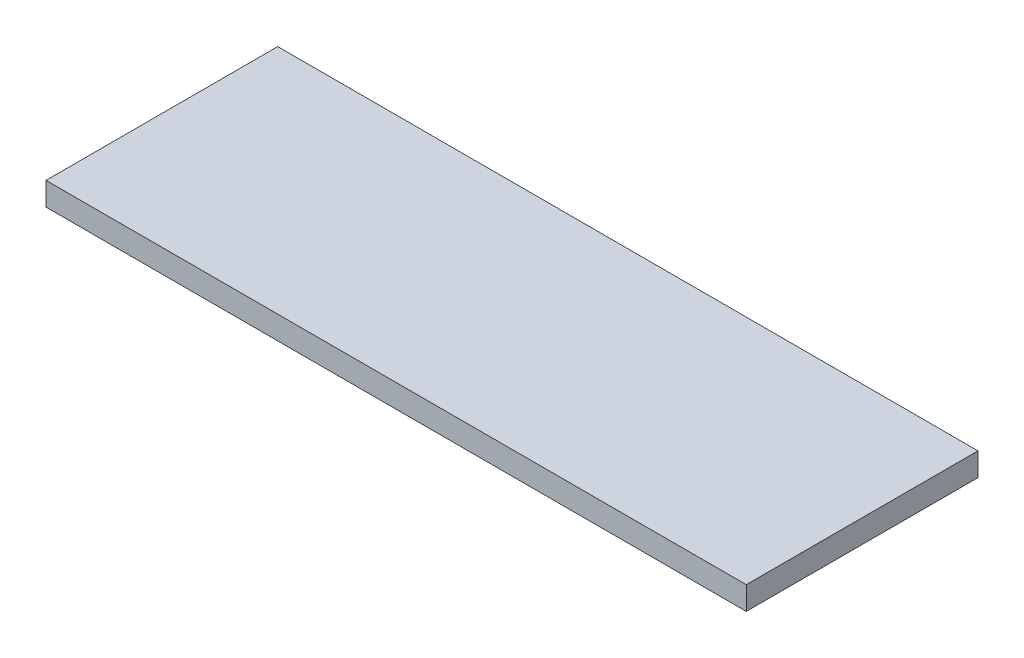
ISO-10303-21;
HEADER;
FILE_DESCRIPTION(('STEP AP214'),'2;1');
FILE_NAME('part.step','',(''),(''),'','','');
FILE_SCHEMA(('AUTOMOTIVE_DESIGN { 1 0 10303 214 1 1 1 1 }'));
ENDSEC;
DATA;
#1=APPLICATION_CONTEXT('core data for automotive mechanical design processes');
#2=APPLICATION_PROTOCOL_DEFINITION('international standard','automotive_design',2000,#1);
#3=PRODUCT_CONTEXT('',#1,'mechanical');
#4=PRODUCT('Part','Part','',(#3));
#5=PRODUCT_RELATED_PRODUCT_CATEGORY('part','',(#4));
#6=PRODUCT_DEFINITION_FORMATION('','',#4);
#7=PRODUCT_DEFINITION_CONTEXT('part definition',#1,'design');
#8=PRODUCT_DEFINITION('design','',#6,#7);
#9=PRODUCT_DEFINITION_SHAPE('','',#8);
#10=(LENGTH_UNIT() NAMED_UNIT(*) SI_UNIT(.MILLI.,.METRE.));
#11=(NAMED_UNIT(*) PLANE_ANGLE_UNIT() SI_UNIT($,.RADIAN.));
#12=(NAMED_UNIT(*) SI_UNIT($,.STERADIAN.) SOLID_ANGLE_UNIT());
#13=UNCERTAINTY_MEASURE_WITH_UNIT(LENGTH_MEASURE(1.E-05),#10,'distance_accuracy_value','');
#14=(GEOMETRIC_REPRESENTATION_CONTEXT(3) GLOBAL_UNCERTAINTY_ASSIGNED_CONTEXT((#13)) GLOBAL_UNIT_ASSIGNED_CONTEXT((#10,
#11,#12)) REPRESENTATION_CONTEXT('',''));
#15=CARTESIAN_POINT('',(0.,0.,0.));
#16=DIRECTION('',(0.,0.,1.));
#17=DIRECTION('',(1.,0.,0.));
#18=AXIS2_PLACEMENT_3D('',#15,#16,#17);
#19=CARTESIAN_POINT('',(-150.628547233686,4.,56.5202333043868));
#20=DIRECTION('',(0.,0.,-1.));
#21=DIRECTION('',(-1.,0.,0.));
#22=AXIS2_PLACEMENT_3D('',#19,#20,#21);
#23=PLANE('',#22);
#24=DIRECTION('',(0.,-1.,0.));
#25=VECTOR('',#24,1.);
#26=CARTESIAN_POINT('',(-29.7472510073546,4.,56.5202333043868));
#27=LINE('',#26,#25);
#28=CARTESIAN_POINT('',(-29.7472510073546,4.,56.5202333043868));
#29=VERTEX_POINT('',#28);
#30=CARTESIAN_POINT('',(-29.7472510073546,0.,56.5202333043868));
#31=VERTEX_POINT('',#30);
#32=EDGE_CURVE('E49',#29,#31,#27,.T.);
#33=ORIENTED_EDGE('',*,*,#32,.F.);
#34=DIRECTION('',(1.,0.,0.));
#35=VECTOR('',#34,1.);
#36=CARTESIAN_POINT('',(-150.628547233686,4.,56.5202333043868));
#37=LINE('',#36,#35);
#38=CARTESIAN_POINT('',(-150.628547233686,4.,56.5202333043868));
#39=VERTEX_POINT('',#38);
#40=EDGE_CURVE('E99',#39,#29,#37,.T.);
#41=ORIENTED_EDGE('',*,*,#40,.F.);
#42=DIRECTION('',(0.,-1.,0.));
#43=VECTOR('',#42,1.);
#44=CARTESIAN_POINT('',(-150.628547233686,4.,56.5202333043868));
#45=LINE('',#44,#43);
#46=CARTESIAN_POINT('',(-150.628547233686,0.,56.5202333043868));
#47=VERTEX_POINT('',#46);
#48=EDGE_CURVE('E43',#39,#47,#45,.T.);
#49=ORIENTED_EDGE('',*,*,#48,.T.);
#50=DIRECTION('',(1.,0.,0.));
#51=VECTOR('',#50,1.);
#52=CARTESIAN_POINT('',(-150.628547233686,0.,56.5202333043868));
#53=LINE('',#52,#51);
#54=EDGE_CURVE('E82',#47,#31,#53,.T.);
#55=ORIENTED_EDGE('',*,*,#54,.T.);
#56=EDGE_LOOP('',(#33,#41,#49,#55));
#57=FACE_BOUND('',#56,.T.);
#58=ADVANCED_FACE('F35',(#57),#23,.F.);
#59=CARTESIAN_POINT('',(-150.628547233686,4.,16.5202333043868));
#60=DIRECTION('',(0.,0.,1.));
#61=DIRECTION('',(1.,0.,0.));
#62=AXIS2_PLACEMENT_3D('',#59,#60,#61);
#63=PLANE('',#62);
#64=DIRECTION('',(0.,1.,0.));
#65=VECTOR('',#64,1.);
#66=CARTESIAN_POINT('',(-29.7472510073546,4.,16.5202333043868));
#67=LINE('',#66,#65);
#68=CARTESIAN_POINT('',(-29.7472510073546,0.,16.5202333043868));
#69=VERTEX_POINT('',#68);
#70=CARTESIAN_POINT('',(-29.7472510073546,4.,16.5202333043868));
#71=VERTEX_POINT('',#70);
#72=EDGE_CURVE('E78',#69,#71,#67,.T.);
#73=ORIENTED_EDGE('',*,*,#72,.F.);
#74=DIRECTION('',(-1.,0.,0.));
#75=VECTOR('',#74,1.);
#76=CARTESIAN_POINT('',(-150.628547233686,0.,16.5202333043868));
#77=LINE('',#76,#75);
#78=CARTESIAN_POINT('',(-150.628547233686,0.,16.5202333043868));
#79=VERTEX_POINT('',#78);
#80=EDGE_CURVE('E72',#69,#79,#77,.T.);
#81=ORIENTED_EDGE('',*,*,#80,.T.);
#82=DIRECTION('',(0.,-1.,0.));
#83=VECTOR('',#82,1.);
#84=CARTESIAN_POINT('',(-150.628547233686,4.,16.5202333043868));
#85=LINE('',#84,#83);
#86=CARTESIAN_POINT('',(-150.628547233686,4.,16.5202333043868));
#87=VERTEX_POINT('',#86);
#88=EDGE_CURVE('E75',#87,#79,#85,.T.);
#89=ORIENTED_EDGE('',*,*,#88,.F.);
#90=DIRECTION('',(-1.,0.,0.));
#91=VECTOR('',#90,1.);
#92=CARTESIAN_POINT('',(-150.628547233686,4.,16.5202333043868));
#93=LINE('',#92,#91);
#94=EDGE_CURVE('E58',#71,#87,#93,.T.);
#95=ORIENTED_EDGE('',*,*,#94,.F.);
#96=EDGE_LOOP('',(#73,#81,#89,#95));
#97=FACE_BOUND('',#96,.T.);
#98=ADVANCED_FACE('F74',(#97),#63,.F.);
#99=CARTESIAN_POINT('',(0.,4.,0.));
#100=DIRECTION('',(0.,1.,0.));
#101=DIRECTION('',(0.,0.,1.));
#102=AXIS2_PLACEMENT_3D('',#99,#100,#101);
#103=PLANE('',#102);
#104=ORIENTED_EDGE('',*,*,#40,.T.);
#105=DIRECTION('',(0.,0.,-1.));
#106=VECTOR('',#105,1.);
#107=CARTESIAN_POINT('',(-29.7472510073546,4.,84.4037938879244));
#108=LINE('',#107,#106);
#109=EDGE_CURVE('E105',#29,#71,#108,.T.);
#110=ORIENTED_EDGE('',*,*,#109,.T.);
#111=ORIENTED_EDGE('',*,*,#94,.T.);
#112=DIRECTION('',(0.,0.,1.));
#113=VECTOR('',#112,1.);
#114=CARTESIAN_POINT('',(-150.628547233686,4.,16.5202333043868));
#115=LINE('',#114,#113);
#116=EDGE_CURVE('E81',#87,#39,#115,.T.);
#117=ORIENTED_EDGE('',*,*,#116,.T.);
#118=EDGE_LOOP('',(#104,#110,#111,#117));
#119=FACE_BOUND('',#118,.T.);
#120=ADVANCED_FACE('F101',(#119),#103,.T.);
#121=CARTESIAN_POINT('',(0.,0.,0.));
#122=DIRECTION('',(0.,1.,0.));
#123=DIRECTION('',(0.,0.,1.));
#124=AXIS2_PLACEMENT_3D('',#121,#122,#123);
#125=PLANE('',#124);
#126=DIRECTION('',(0.,0.,-1.));
#127=VECTOR('',#126,1.);
#128=CARTESIAN_POINT('',(-29.7472510073546,0.,0.));
#129=LINE('',#128,#127);
#130=EDGE_CURVE('E11',#31,#69,#129,.T.);
#131=ORIENTED_EDGE('',*,*,#130,.F.);
#132=ORIENTED_EDGE('',*,*,#54,.F.);
#133=DIRECTION('',(0.,0.,1.));
#134=VECTOR('',#133,1.);
#135=CARTESIAN_POINT('',(-150.628547233686,0.,16.5202333043868));
#136=LINE('',#135,#134);
#137=EDGE_CURVE('E87',#79,#47,#136,.T.);
#138=ORIENTED_EDGE('',*,*,#137,.F.);
#139=ORIENTED_EDGE('',*,*,#80,.F.);
#140=EDGE_LOOP('',(#131,#132,#138,#139));
#141=FACE_BOUND('',#140,.T.);
#142=ADVANCED_FACE('F89',(#141),#125,.F.);
#143=CARTESIAN_POINT('',(-150.628547233686,4.,16.5202333043868));
#144=DIRECTION('',(1.,0.,0.));
#145=DIRECTION('',(0.,0.,-1.));
#146=AXIS2_PLACEMENT_3D('',#143,#144,#145);
#147=PLANE('',#146);
#148=ORIENTED_EDGE('',*,*,#137,.T.);
#149=ORIENTED_EDGE('',*,*,#48,.F.);
#150=ORIENTED_EDGE('',*,*,#116,.F.);
#151=ORIENTED_EDGE('',*,*,#88,.T.);
#152=EDGE_LOOP('',(#148,#149,#150,#151));
#153=FACE_BOUND('',#152,.T.);
#154=ADVANCED_FACE('F37',(#153),#147,.F.);
#155=CARTESIAN_POINT('',(-29.7472510073546,-6.,84.4037938879244));
#156=DIRECTION('',(1.,0.,0.));
#157=DIRECTION('',(0.,0.,-1.));
#158=AXIS2_PLACEMENT_3D('',#155,#156,#157);
#159=PLANE('',#158);
#160=ORIENTED_EDGE('',*,*,#32,.T.);
#161=ORIENTED_EDGE('',*,*,#130,.T.);
#162=ORIENTED_EDGE('',*,*,#72,.T.);
#163=ORIENTED_EDGE('',*,*,#109,.F.);
#164=EDGE_LOOP('',(#160,#161,#162,#163));
#165=FACE_BOUND('',#164,.T.);
#166=ADVANCED_FACE('F108',(#165),#159,.T.);
#167=CLOSED_SHELL('',(#58,#98,#120,#142,#154,#166));
#168=MANIFOLD_SOLID_BREP('B2',#167);
#169=ADVANCED_BREP_SHAPE_REPRESENTATION('',(#18,#168),#14);
#170=SHAPE_DEFINITION_REPRESENTATION(#9,#169);
ENDSEC;
END-ISO-10303-21;
